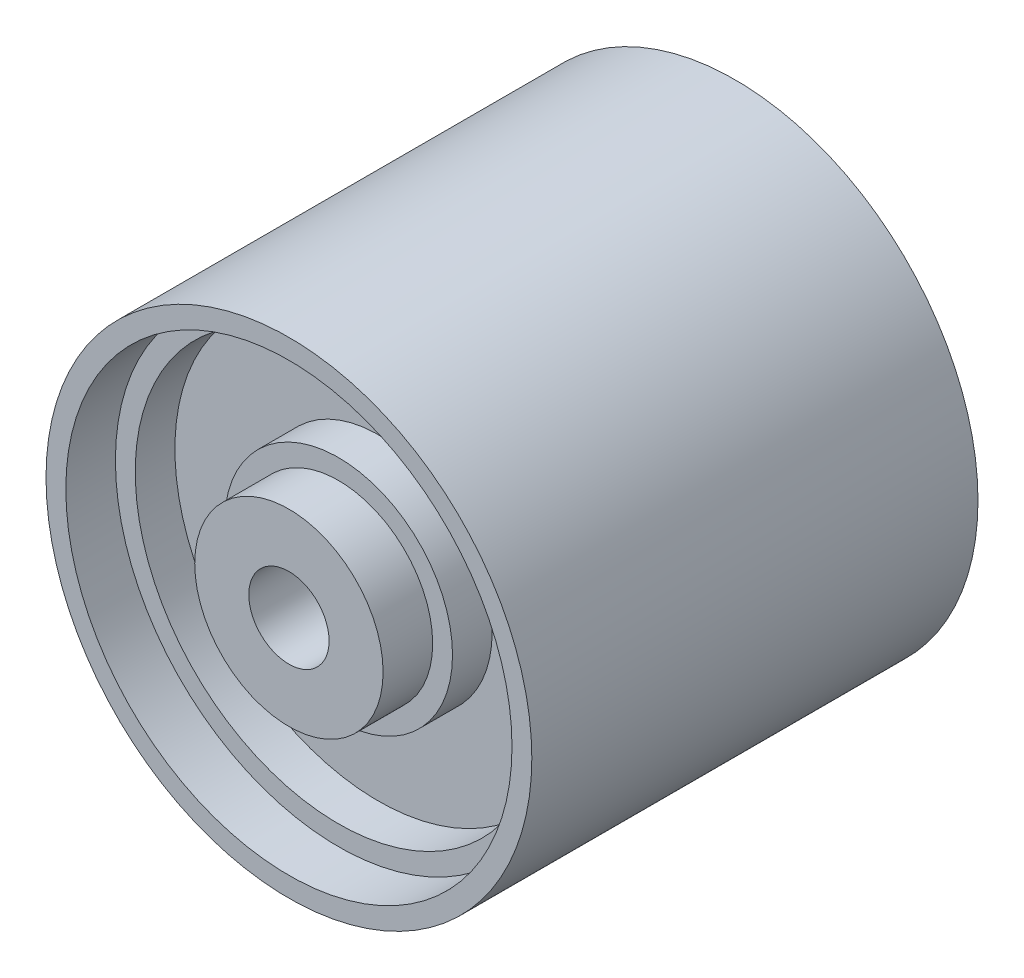
ISO-10303-21;
HEADER;
FILE_DESCRIPTION(('STEP AP214'),'2;1');
FILE_NAME('part.step','',(''),(''),'','','');
FILE_SCHEMA(('AUTOMOTIVE_DESIGN { 1 0 10303 214 1 1 1 1 }'));
ENDSEC;
DATA;
#1=APPLICATION_CONTEXT('core data for automotive mechanical design processes');
#2=APPLICATION_PROTOCOL_DEFINITION('international standard','automotive_design',2000,#1);
#3=PRODUCT_CONTEXT('',#1,'mechanical');
#4=PRODUCT('Part','Part','',(#3));
#5=PRODUCT_RELATED_PRODUCT_CATEGORY('part','',(#4));
#6=PRODUCT_DEFINITION_FORMATION('','',#4);
#7=PRODUCT_DEFINITION_CONTEXT('part definition',#1,'design');
#8=PRODUCT_DEFINITION('design','',#6,#7);
#9=PRODUCT_DEFINITION_SHAPE('','',#8);
#10=(LENGTH_UNIT() NAMED_UNIT(*) SI_UNIT(.MILLI.,.METRE.));
#11=(NAMED_UNIT(*) PLANE_ANGLE_UNIT() SI_UNIT($,.RADIAN.));
#12=(NAMED_UNIT(*) SI_UNIT($,.STERADIAN.) SOLID_ANGLE_UNIT());
#13=UNCERTAINTY_MEASURE_WITH_UNIT(LENGTH_MEASURE(1.E-05),#10,'distance_accuracy_value','');
#14=(GEOMETRIC_REPRESENTATION_CONTEXT(3) GLOBAL_UNCERTAINTY_ASSIGNED_CONTEXT((#13)) GLOBAL_UNIT_ASSIGNED_CONTEXT((#10,
#11,#12)) REPRESENTATION_CONTEXT('',''));
#15=CARTESIAN_POINT('',(0.,0.,0.));
#16=DIRECTION('',(0.,0.,1.));
#17=DIRECTION('',(1.,0.,0.));
#18=AXIS2_PLACEMENT_3D('',#15,#16,#17);
#19=CARTESIAN_POINT('',(0.,0.,-45.));
#20=DIRECTION('',(0.,0.,1.));
#21=DIRECTION('',(1.,0.,0.));
#22=AXIS2_PLACEMENT_3D('',#19,#20,#21);
#23=PLANE('',#22);
#24=CARTESIAN_POINT('',(0.,0.,-45.));
#25=DIRECTION('',(0.,0.,1.));
#26=DIRECTION('',(1.,0.,0.));
#27=AXIS2_PLACEMENT_3D('',#24,#25,#26);
#28=CIRCLE('',#27,4.05);
#29=CARTESIAN_POINT('',(4.05,0.,-45.));
#30=VERTEX_POINT('',#29);
#31=EDGE_CURVE('E45',#30,#30,#28,.T.);
#32=ORIENTED_EDGE('',*,*,#31,.T.);
#33=EDGE_LOOP('',(#32));
#34=FACE_BOUND('',#33,.T.);
#35=CARTESIAN_POINT('',(0.,0.,-45.));
#36=DIRECTION('',(0.,0.,-1.));
#37=DIRECTION('',(-1.,0.,0.));
#38=AXIS2_PLACEMENT_3D('',#35,#36,#37);
#39=CIRCLE('',#38,9.5);
#40=CARTESIAN_POINT('',(-9.5,0.,-45.));
#41=VERTEX_POINT('',#40);
#42=EDGE_CURVE('E111',#41,#41,#39,.T.);
#43=ORIENTED_EDGE('',*,*,#42,.T.);
#44=EDGE_LOOP('',(#43));
#45=FACE_BOUND('',#44,.T.);
#46=ADVANCED_FACE('F32',(#34,#45),#23,.F.);
#47=CARTESIAN_POINT('',(0.,0.,0.));
#48=DIRECTION('',(0.,0.,1.));
#49=DIRECTION('',(1.,0.,0.));
#50=AXIS2_PLACEMENT_3D('',#47,#48,#49);
#51=PLANE('',#50);
#52=CARTESIAN_POINT('',(0.,0.,0.));
#53=DIRECTION('',(0.,0.,1.));
#54=DIRECTION('',(1.,0.,0.));
#55=AXIS2_PLACEMENT_3D('',#52,#53,#54);
#56=CIRCLE('',#55,4.05);
#57=CARTESIAN_POINT('',(4.05,0.,0.));
#58=VERTEX_POINT('',#57);
#59=EDGE_CURVE('E48',#58,#58,#56,.T.);
#60=ORIENTED_EDGE('',*,*,#59,.F.);
#61=EDGE_LOOP('',(#60));
#62=FACE_BOUND('',#61,.T.);
#63=CARTESIAN_POINT('',(0.,0.,0.));
#64=DIRECTION('',(0.,0.,1.));
#65=DIRECTION('',(1.,0.,0.));
#66=AXIS2_PLACEMENT_3D('',#63,#64,#65);
#67=CIRCLE('',#66,9.5);
#68=CARTESIAN_POINT('',(9.5,0.,0.));
#69=VERTEX_POINT('',#68);
#70=EDGE_CURVE('E68',#69,#69,#67,.T.);
#71=ORIENTED_EDGE('',*,*,#70,.T.);
#72=EDGE_LOOP('',(#71));
#73=FACE_BOUND('',#72,.T.);
#74=ADVANCED_FACE('F89',(#62,#73),#51,.T.);
#75=CARTESIAN_POINT('',(0.,0.,-45.));
#76=DIRECTION('',(0.,0.,1.));
#77=DIRECTION('',(1.,0.,0.));
#78=AXIS2_PLACEMENT_3D('',#75,#76,#77);
#79=CYLINDRICAL_SURFACE('',#78,24.5);
#80=CARTESIAN_POINT('',(0.,0.,-45.));
#81=DIRECTION('',(0.,0.,1.));
#82=DIRECTION('',(1.,0.,0.));
#83=AXIS2_PLACEMENT_3D('',#80,#81,#82);
#84=CIRCLE('',#83,24.5);
#85=CARTESIAN_POINT('',(24.5,0.,-45.));
#86=VERTEX_POINT('',#85);
#87=EDGE_CURVE('E10',#86,#86,#84,.T.);
#88=CARTESIAN_POINT('',(0.,0.,0.));
#89=DIRECTION('',(0.,0.,1.));
#90=DIRECTION('',(1.,0.,0.));
#91=AXIS2_PLACEMENT_3D('',#88,#89,#90);
#92=CIRCLE('',#91,24.5);
#93=CARTESIAN_POINT('',(24.5,0.,0.));
#94=VERTEX_POINT('',#93);
#95=EDGE_CURVE('E40',#94,#94,#92,.T.);
#96=CARTESIAN_POINT('',(24.5,0.,-45.));
#97=CARTESIAN_POINT('',(24.5,0.,-44.53125));
#98=CARTESIAN_POINT('',(24.5,0.,-44.0625));
#99=CARTESIAN_POINT('',(24.5,0.,-43.125));
#100=CARTESIAN_POINT('',(24.5,0.,-42.65625));
#101=CARTESIAN_POINT('',(24.5,0.,-41.71875));
#102=CARTESIAN_POINT('',(24.5,0.,-41.25));
#103=CARTESIAN_POINT('',(24.5,0.,-40.3125));
#104=CARTESIAN_POINT('',(24.5,0.,-39.84375));
#105=CARTESIAN_POINT('',(24.5,0.,-38.90625));
#106=CARTESIAN_POINT('',(24.5,0.,-38.4375));
#107=CARTESIAN_POINT('',(24.5,0.,-37.5));
#108=CARTESIAN_POINT('',(24.5,0.,-37.03125));
#109=CARTESIAN_POINT('',(24.5,0.,-36.09375));
#110=CARTESIAN_POINT('',(24.5,0.,-35.625));
#111=CARTESIAN_POINT('',(24.5,0.,-34.6875));
#112=CARTESIAN_POINT('',(24.5,0.,-34.21875));
#113=CARTESIAN_POINT('',(24.5,0.,-33.28125));
#114=CARTESIAN_POINT('',(24.5,0.,-32.8125));
#115=CARTESIAN_POINT('',(24.5,0.,-31.875));
#116=CARTESIAN_POINT('',(24.5,0.,-31.40625));
#117=CARTESIAN_POINT('',(24.5,0.,-30.46875));
#118=CARTESIAN_POINT('',(24.5,0.,-30.));
#119=CARTESIAN_POINT('',(24.5,0.,-29.0625));
#120=CARTESIAN_POINT('',(24.5,0.,-28.59375));
#121=CARTESIAN_POINT('',(24.5,0.,-27.65625));
#122=CARTESIAN_POINT('',(24.5,0.,-27.1875));
#123=CARTESIAN_POINT('',(24.5,0.,-26.25));
#124=CARTESIAN_POINT('',(24.5,0.,-25.78125));
#125=CARTESIAN_POINT('',(24.5,0.,-24.84375));
#126=CARTESIAN_POINT('',(24.5,0.,-24.375));
#127=CARTESIAN_POINT('',(24.5,0.,-23.4375));
#128=CARTESIAN_POINT('',(24.5,0.,-22.96875));
#129=CARTESIAN_POINT('',(24.5,0.,-22.03125));
#130=CARTESIAN_POINT('',(24.5,0.,-21.5625));
#131=CARTESIAN_POINT('',(24.5,0.,-20.625));
#132=CARTESIAN_POINT('',(24.5,0.,-20.15625));
#133=CARTESIAN_POINT('',(24.5,0.,-19.21875));
#134=CARTESIAN_POINT('',(24.5,0.,-18.75));
#135=CARTESIAN_POINT('',(24.5,0.,-17.8125));
#136=CARTESIAN_POINT('',(24.5,0.,-17.34375));
#137=CARTESIAN_POINT('',(24.5,0.,-16.40625));
#138=CARTESIAN_POINT('',(24.5,0.,-15.9375));
#139=CARTESIAN_POINT('',(24.5,0.,-15.));
#140=CARTESIAN_POINT('',(24.5,0.,-14.53125));
#141=CARTESIAN_POINT('',(24.5,0.,-13.59375));
#142=CARTESIAN_POINT('',(24.5,0.,-13.125));
#143=CARTESIAN_POINT('',(24.5,0.,-12.1875));
#144=CARTESIAN_POINT('',(24.5,0.,-11.71875));
#145=CARTESIAN_POINT('',(24.5,0.,-10.78125));
#146=CARTESIAN_POINT('',(24.5,0.,-10.3125));
#147=CARTESIAN_POINT('',(24.5,0.,-9.37500000000001));
#148=CARTESIAN_POINT('',(24.5,0.,-8.90625000000001));
#149=CARTESIAN_POINT('',(24.5,0.,-7.96875000000001));
#150=CARTESIAN_POINT('',(24.5,0.,-7.50000000000001));
#151=CARTESIAN_POINT('',(24.5,0.,-6.56250000000001));
#152=CARTESIAN_POINT('',(24.5,0.,-6.09375000000001));
#153=CARTESIAN_POINT('',(24.5,0.,-5.15625000000001));
#154=CARTESIAN_POINT('',(24.5,0.,-4.68750000000001));
#155=CARTESIAN_POINT('',(24.5,0.,-3.75000000000001));
#156=CARTESIAN_POINT('',(24.5,0.,-3.28125000000001));
#157=CARTESIAN_POINT('',(24.5,0.,-2.34375000000001));
#158=CARTESIAN_POINT('',(24.5,0.,-1.87500000000001));
#159=CARTESIAN_POINT('',(24.5,0.,-0.937500000000006));
#160=CARTESIAN_POINT('',(24.5,0.,-0.468750000000007));
#161=CARTESIAN_POINT('',(24.5,0.,0.));
#162=B_SPLINE_CURVE_WITH_KNOTS('',3,(#96,#97,#98,#99,#100,#101,#102,#103,#104,#105,#106,#107,
#108,#109,#110,#111,#112,#113,#114,#115,#116,#117,#118,#119,#120,#121,#122,#123,#124,#125,#126,
#127,#128,#129,#130,#131,#132,#133,#134,#135,#136,#137,#138,#139,#140,#141,#142,#143,#144,#145,
#146,#147,#148,#149,#150,#151,#152,#153,#154,#155,#156,#157,#158,#159,#160,#161),.UNSPECIFIED.,
.F.,.F.,(4,2,2,2,2,2,2,2,2,2,2,2,2,2,2,2,2,2,2,2,2,2,2,2,2,2,2,2,2,2,2,2,4),(0.,1.40625,2.8125,
4.21875,5.62500000000001,7.03125,8.4375,9.84375000000001,11.25,12.65625,14.0625,15.46875,16.875,
18.28125,19.6875,21.09375,22.5,23.90625,25.3125,26.71875,28.125,29.53125,30.9375,32.34375,33.75,
35.15625,36.5625,37.96875,39.375,40.78125,42.1875,43.59375,45.),.UNSPECIFIED.);
#163=EDGE_CURVE('BSEAM34',#86,#94,#162,.T.);
#164=ORIENTED_EDGE('',*,*,#87,.T.);
#165=ORIENTED_EDGE('',*,*,#95,.F.);
#166=ORIENTED_EDGE('',*,*,#163,.T.);
#167=ORIENTED_EDGE('',*,*,#163,.F.);
#168=EDGE_LOOP('',(#164,#166,#165,#167));
#169=FACE_BOUND('',#168,.T.);
#170=ADVANCED_FACE('F34',(#169),#79,.T.);
#171=CARTESIAN_POINT('',(0.,0.,-45.));
#172=DIRECTION('',(0.,0.,-1.));
#173=DIRECTION('',(-1.,0.,0.));
#174=AXIS2_PLACEMENT_3D('',#171,#172,#173);
#175=CIRCLE('',#174,22.5);
#176=CARTESIAN_POINT('',(-22.5,0.,-45.));
#177=VERTEX_POINT('',#176);
#178=EDGE_CURVE('E105',#177,#177,#175,.T.);
#179=ORIENTED_EDGE('',*,*,#178,.F.);
#180=EDGE_LOOP('',(#179));
#181=FACE_BOUND('',#180,.T.);
#182=ORIENTED_EDGE('',*,*,#87,.F.);
#183=EDGE_LOOP('',(#182));
#184=FACE_BOUND('',#183,.T.);
#185=ADVANCED_FACE('F141',(#181,#184),#23,.F.);
#186=CARTESIAN_POINT('',(0.,0.,0.));
#187=DIRECTION('',(0.,0.,1.));
#188=DIRECTION('',(1.,0.,0.));
#189=AXIS2_PLACEMENT_3D('',#186,#187,#188);
#190=CIRCLE('',#189,22.5);
#191=CARTESIAN_POINT('',(22.5,0.,0.));
#192=VERTEX_POINT('',#191);
#193=EDGE_CURVE('E60',#192,#192,#190,.T.);
#194=ORIENTED_EDGE('',*,*,#193,.F.);
#195=EDGE_LOOP('',(#194));
#196=FACE_BOUND('',#195,.T.);
#197=ORIENTED_EDGE('',*,*,#95,.T.);
#198=EDGE_LOOP('',(#197));
#199=FACE_BOUND('',#198,.T.);
#200=ADVANCED_FACE('F92',(#196,#199),#51,.T.);
#201=CARTESIAN_POINT('',(0.,0.,-45.));
#202=DIRECTION('',(0.,0.,1.));
#203=DIRECTION('',(1.,0.,0.));
#204=AXIS2_PLACEMENT_3D('',#201,#202,#203);
#205=CYLINDRICAL_SURFACE('',#204,4.05);
#206=CARTESIAN_POINT('',(4.05,0.,-45.));
#207=CARTESIAN_POINT('',(4.05,0.,-44.53125));
#208=CARTESIAN_POINT('',(4.05,0.,-44.0625));
#209=CARTESIAN_POINT('',(4.05,0.,-43.125));
#210=CARTESIAN_POINT('',(4.05,0.,-42.65625));
#211=CARTESIAN_POINT('',(4.05,0.,-41.71875));
#212=CARTESIAN_POINT('',(4.05,0.,-41.25));
#213=CARTESIAN_POINT('',(4.05,0.,-40.3125));
#214=CARTESIAN_POINT('',(4.05,0.,-39.84375));
#215=CARTESIAN_POINT('',(4.05,0.,-38.90625));
#216=CARTESIAN_POINT('',(4.05,0.,-38.4375));
#217=CARTESIAN_POINT('',(4.05,0.,-37.5));
#218=CARTESIAN_POINT('',(4.05,0.,-37.03125));
#219=CARTESIAN_POINT('',(4.05,0.,-36.09375));
#220=CARTESIAN_POINT('',(4.05,0.,-35.625));
#221=CARTESIAN_POINT('',(4.05,0.,-34.6875));
#222=CARTESIAN_POINT('',(4.05,0.,-34.21875));
#223=CARTESIAN_POINT('',(4.05,0.,-33.28125));
#224=CARTESIAN_POINT('',(4.05,0.,-32.8125));
#225=CARTESIAN_POINT('',(4.05,0.,-31.875));
#226=CARTESIAN_POINT('',(4.05,0.,-31.40625));
#227=CARTESIAN_POINT('',(4.05,0.,-30.46875));
#228=CARTESIAN_POINT('',(4.05,0.,-30.));
#229=CARTESIAN_POINT('',(4.05,0.,-29.0625));
#230=CARTESIAN_POINT('',(4.05,0.,-28.59375));
#231=CARTESIAN_POINT('',(4.05,0.,-27.65625));
#232=CARTESIAN_POINT('',(4.05,0.,-27.1875));
#233=CARTESIAN_POINT('',(4.05,0.,-26.25));
#234=CARTESIAN_POINT('',(4.05,0.,-25.78125));
#235=CARTESIAN_POINT('',(4.05,0.,-24.84375));
#236=CARTESIAN_POINT('',(4.05,0.,-24.375));
#237=CARTESIAN_POINT('',(4.05,0.,-23.4375));
#238=CARTESIAN_POINT('',(4.05,0.,-22.96875));
#239=CARTESIAN_POINT('',(4.05,0.,-22.03125));
#240=CARTESIAN_POINT('',(4.05,0.,-21.5625));
#241=CARTESIAN_POINT('',(4.05,0.,-20.625));
#242=CARTESIAN_POINT('',(4.05,0.,-20.15625));
#243=CARTESIAN_POINT('',(4.05,0.,-19.21875));
#244=CARTESIAN_POINT('',(4.05,0.,-18.75));
#245=CARTESIAN_POINT('',(4.05,0.,-17.8125));
#246=CARTESIAN_POINT('',(4.05,0.,-17.34375));
#247=CARTESIAN_POINT('',(4.05,0.,-16.40625));
#248=CARTESIAN_POINT('',(4.05,0.,-15.9375));
#249=CARTESIAN_POINT('',(4.05,0.,-15.));
#250=CARTESIAN_POINT('',(4.05,0.,-14.53125));
#251=CARTESIAN_POINT('',(4.05,0.,-13.59375));
#252=CARTESIAN_POINT('',(4.05,0.,-13.125));
#253=CARTESIAN_POINT('',(4.05,0.,-12.1875));
#254=CARTESIAN_POINT('',(4.05,0.,-11.71875));
#255=CARTESIAN_POINT('',(4.05,0.,-10.78125));
#256=CARTESIAN_POINT('',(4.05,0.,-10.3125));
#257=CARTESIAN_POINT('',(4.05,0.,-9.37500000000001));
#258=CARTESIAN_POINT('',(4.05,0.,-8.90625000000001));
#259=CARTESIAN_POINT('',(4.05,0.,-7.96875000000001));
#260=CARTESIAN_POINT('',(4.05,0.,-7.50000000000001));
#261=CARTESIAN_POINT('',(4.05,0.,-6.56250000000001));
#262=CARTESIAN_POINT('',(4.05,0.,-6.09375000000001));
#263=CARTESIAN_POINT('',(4.05,0.,-5.15625000000001));
#264=CARTESIAN_POINT('',(4.05,0.,-4.68750000000001));
#265=CARTESIAN_POINT('',(4.05,0.,-3.75000000000001));
#266=CARTESIAN_POINT('',(4.05,0.,-3.28125000000001));
#267=CARTESIAN_POINT('',(4.05,0.,-2.34375000000001));
#268=CARTESIAN_POINT('',(4.05,0.,-1.87500000000001));
#269=CARTESIAN_POINT('',(4.05,0.,-0.937500000000006));
#270=CARTESIAN_POINT('',(4.05,0.,-0.468750000000007));
#271=CARTESIAN_POINT('',(4.05,0.,0.));
#272=B_SPLINE_CURVE_WITH_KNOTS('',3,(#206,#207,#208,#209,#210,#211,#212,#213,#214,#215,#216,
#217,#218,#219,#220,#221,#222,#223,#224,#225,#226,#227,#228,#229,#230,#231,#232,#233,#234,#235,
#236,#237,#238,#239,#240,#241,#242,#243,#244,#245,#246,#247,#248,#249,#250,#251,#252,#253,#254,
#255,#256,#257,#258,#259,#260,#261,#262,#263,#264,#265,#266,#267,#268,#269,#270,#271),
.UNSPECIFIED.,.F.,.F.,(4,2,2,2,2,2,2,2,2,2,2,2,2,2,2,2,2,2,2,2,2,2,2,2,2,2,2,2,2,2,2,2,4),(0.,
1.40625,2.8125,4.21874999999999,5.625,7.03125,8.43749999999999,9.84375,11.25,12.65625,14.0625,
15.46875,16.875,18.28125,19.6875,21.09375,22.5,23.90625,25.3125,26.71875,28.125,29.53125,
30.9375,32.34375,33.75,35.15625,36.5625,37.96875,39.375,40.78125,42.1875,43.59375,45.),.UNSPECIFIED.);
#273=EDGE_CURVE('BSEAM87',#30,#58,#272,.T.);
#274=ORIENTED_EDGE('',*,*,#31,.F.);
#275=ORIENTED_EDGE('',*,*,#59,.T.);
#276=ORIENTED_EDGE('',*,*,#273,.T.);
#277=ORIENTED_EDGE('',*,*,#273,.F.);
#278=EDGE_LOOP('',(#274,#276,#275,#277));
#279=FACE_BOUND('',#278,.T.);
#280=ADVANCED_FACE('F87',(#279),#205,.F.);
#281=CARTESIAN_POINT('',(0.,0.,-5.));
#282=DIRECTION('',(0.,0.,1.));
#283=DIRECTION('',(1.,0.,0.));
#284=AXIS2_PLACEMENT_3D('',#281,#282,#283);
#285=PLANE('',#284);
#286=CARTESIAN_POINT('',(0.,0.,-5.));
#287=DIRECTION('',(0.,0.,1.));
#288=DIRECTION('',(1.,0.,0.));
#289=AXIS2_PLACEMENT_3D('',#286,#287,#288);
#290=CIRCLE('',#289,11.5);
#291=CARTESIAN_POINT('',(11.5,0.,-5.));
#292=VERTEX_POINT('',#291);
#293=EDGE_CURVE('E50',#292,#292,#290,.F.);
#294=ORIENTED_EDGE('',*,*,#293,.F.);
#295=EDGE_LOOP('',(#294));
#296=FACE_BOUND('',#295,.T.);
#297=CARTESIAN_POINT('',(0.,0.,-5.));
#298=DIRECTION('',(0.,0.,1.));
#299=DIRECTION('',(1.,0.,0.));
#300=AXIS2_PLACEMENT_3D('',#297,#298,#299);
#301=CIRCLE('',#300,9.5);
#302=CARTESIAN_POINT('',(9.5,0.,-5.));
#303=VERTEX_POINT('',#302);
#304=EDGE_CURVE('E65',#303,#303,#301,.T.);
#305=ORIENTED_EDGE('',*,*,#304,.F.);
#306=EDGE_LOOP('',(#305));
#307=FACE_BOUND('',#306,.T.);
#308=ADVANCED_FACE('F171',(#296,#307),#285,.T.);
#309=CARTESIAN_POINT('',(0.,0.,-5.));
#310=DIRECTION('',(0.,0.,1.));
#311=DIRECTION('',(1.,0.,0.));
#312=AXIS2_PLACEMENT_3D('',#309,#310,#311);
#313=CYLINDRICAL_SURFACE('',#312,9.5);
#314=ORIENTED_EDGE('',*,*,#304,.T.);
#315=EDGE_LOOP('',(#314));
#316=FACE_BOUND('',#315,.T.);
#317=ORIENTED_EDGE('',*,*,#70,.F.);
#318=EDGE_LOOP('',(#317));
#319=FACE_BOUND('',#318,.T.);
#320=ADVANCED_FACE('F167',(#316,#319),#313,.T.);
#321=CARTESIAN_POINT('',(0.,0.,-5.));
#322=DIRECTION('',(0.,0.,1.));
#323=DIRECTION('',(1.,0.,0.));
#324=AXIS2_PLACEMENT_3D('',#321,#322,#323);
#325=CIRCLE('',#324,22.5);
#326=CARTESIAN_POINT('',(22.5,0.,-5.));
#327=VERTEX_POINT('',#326);
#328=EDGE_CURVE('E53',#327,#327,#325,.T.);
#329=ORIENTED_EDGE('',*,*,#328,.T.);
#330=EDGE_LOOP('',(#329));
#331=FACE_BOUND('',#330,.T.);
#332=CARTESIAN_POINT('',(0.,0.,-5.));
#333=DIRECTION('',(0.,0.,1.));
#334=DIRECTION('',(1.,0.,0.));
#335=AXIS2_PLACEMENT_3D('',#332,#333,#334);
#336=CIRCLE('',#335,20.5);
#337=CARTESIAN_POINT('',(20.5,0.,-5.));
#338=VERTEX_POINT('',#337);
#339=EDGE_CURVE('E52',#338,#338,#336,.F.);
#340=ORIENTED_EDGE('',*,*,#339,.T.);
#341=EDGE_LOOP('',(#340));
#342=FACE_BOUND('',#341,.T.);
#343=ADVANCED_FACE('F170',(#331,#342),#285,.T.);
#344=CARTESIAN_POINT('',(0.,0.,-5.));
#345=DIRECTION('',(0.,0.,1.));
#346=DIRECTION('',(1.,0.,0.));
#347=AXIS2_PLACEMENT_3D('',#344,#345,#346);
#348=CYLINDRICAL_SURFACE('',#347,22.5);
#349=ORIENTED_EDGE('',*,*,#328,.F.);
#350=EDGE_LOOP('',(#349));
#351=FACE_BOUND('',#350,.T.);
#352=ORIENTED_EDGE('',*,*,#193,.T.);
#353=EDGE_LOOP('',(#352));
#354=FACE_BOUND('',#353,.T.);
#355=ADVANCED_FACE('F176',(#351,#354),#348,.F.);
#356=CARTESIAN_POINT('',(0.,0.,-9.));
#357=DIRECTION('',(0.,0.,1.));
#358=DIRECTION('',(1.,0.,0.));
#359=AXIS2_PLACEMENT_3D('',#356,#357,#358);
#360=CYLINDRICAL_SURFACE('',#359,20.5);
#361=CARTESIAN_POINT('',(0.,0.,-9.));
#362=DIRECTION('',(0.,0.,1.));
#363=DIRECTION('',(1.,0.,0.));
#364=AXIS2_PLACEMENT_3D('',#361,#362,#363);
#365=CIRCLE('',#364,20.5);
#366=CARTESIAN_POINT('',(20.5,0.,-9.));
#367=VERTEX_POINT('',#366);
#368=EDGE_CURVE('E79',#367,#367,#365,.T.);
#369=ORIENTED_EDGE('',*,*,#368,.F.);
#370=EDGE_LOOP('',(#369));
#371=FACE_BOUND('',#370,.T.);
#372=ORIENTED_EDGE('',*,*,#339,.F.);
#373=EDGE_LOOP('',(#372));
#374=FACE_BOUND('',#373,.T.);
#375=ADVANCED_FACE('F179',(#371,#374),#360,.F.);
#376=CARTESIAN_POINT('',(0.,0.,-9.));
#377=DIRECTION('',(0.,0.,1.));
#378=DIRECTION('',(1.,0.,0.));
#379=AXIS2_PLACEMENT_3D('',#376,#377,#378);
#380=PLANE('',#379);
#381=CARTESIAN_POINT('',(0.,0.,-9.));
#382=DIRECTION('',(0.,0.,1.));
#383=DIRECTION('',(1.,0.,0.));
#384=AXIS2_PLACEMENT_3D('',#381,#382,#383);
#385=CIRCLE('',#384,11.5);
#386=CARTESIAN_POINT('',(11.5,0.,-9.));
#387=VERTEX_POINT('',#386);
#388=EDGE_CURVE('E76',#387,#387,#385,.T.);
#389=ORIENTED_EDGE('',*,*,#388,.F.);
#390=EDGE_LOOP('',(#389));
#391=FACE_BOUND('',#390,.T.);
#392=ORIENTED_EDGE('',*,*,#368,.T.);
#393=EDGE_LOOP('',(#392));
#394=FACE_BOUND('',#393,.T.);
#395=ADVANCED_FACE('F131',(#391,#394),#380,.T.);
#396=CARTESIAN_POINT('',(0.,0.,-9.));
#397=DIRECTION('',(0.,0.,1.));
#398=DIRECTION('',(1.,0.,0.));
#399=AXIS2_PLACEMENT_3D('',#396,#397,#398);
#400=CYLINDRICAL_SURFACE('',#399,11.5);
#401=ORIENTED_EDGE('',*,*,#388,.T.);
#402=EDGE_LOOP('',(#401));
#403=FACE_BOUND('',#402,.T.);
#404=ORIENTED_EDGE('',*,*,#293,.T.);
#405=EDGE_LOOP('',(#404));
#406=FACE_BOUND('',#405,.T.);
#407=ADVANCED_FACE('F122',(#403,#406),#400,.T.);
#408=CARTESIAN_POINT('',(0.,0.,-40.));
#409=DIRECTION('',(0.,0.,-1.));
#410=DIRECTION('',(-1.,0.,0.));
#411=AXIS2_PLACEMENT_3D('',#408,#409,#410);
#412=PLANE('',#411);
#413=CARTESIAN_POINT('',(0.,0.,-40.));
#414=DIRECTION('',(0.,0.,-1.));
#415=DIRECTION('',(-1.,0.,0.));
#416=AXIS2_PLACEMENT_3D('',#413,#414,#415);
#417=CIRCLE('',#416,11.5);
#418=CARTESIAN_POINT('',(-11.5,0.,-40.));
#419=VERTEX_POINT('',#418);
#420=EDGE_CURVE('E36',#419,#419,#417,.F.);
#421=ORIENTED_EDGE('',*,*,#420,.F.);
#422=EDGE_LOOP('',(#421));
#423=FACE_BOUND('',#422,.T.);
#424=CARTESIAN_POINT('',(0.,0.,-40.));
#425=DIRECTION('',(0.,0.,-1.));
#426=DIRECTION('',(-1.,0.,0.));
#427=AXIS2_PLACEMENT_3D('',#424,#425,#426);
#428=CIRCLE('',#427,9.5);
#429=CARTESIAN_POINT('',(-9.5,0.,-40.));
#430=VERTEX_POINT('',#429);
#431=EDGE_CURVE('E108',#430,#430,#428,.T.);
#432=ORIENTED_EDGE('',*,*,#431,.F.);
#433=EDGE_LOOP('',(#432));
#434=FACE_BOUND('',#433,.T.);
#435=ADVANCED_FACE('F120',(#423,#434),#412,.T.);
#436=CARTESIAN_POINT('',(0.,0.,-40.));
#437=DIRECTION('',(0.,0.,-1.));
#438=DIRECTION('',(-1.,0.,0.));
#439=AXIS2_PLACEMENT_3D('',#436,#437,#438);
#440=CYLINDRICAL_SURFACE('',#439,9.5);
#441=ORIENTED_EDGE('',*,*,#431,.T.);
#442=EDGE_LOOP('',(#441));
#443=FACE_BOUND('',#442,.T.);
#444=ORIENTED_EDGE('',*,*,#42,.F.);
#445=EDGE_LOOP('',(#444));
#446=FACE_BOUND('',#445,.T.);
#447=ADVANCED_FACE('F117',(#443,#446),#440,.T.);
#448=CARTESIAN_POINT('',(0.,0.,-40.));
#449=DIRECTION('',(0.,0.,-1.));
#450=DIRECTION('',(-1.,0.,0.));
#451=AXIS2_PLACEMENT_3D('',#448,#449,#450);
#452=CIRCLE('',#451,22.5);
#453=CARTESIAN_POINT('',(-22.5,0.,-40.));
#454=VERTEX_POINT('',#453);
#455=EDGE_CURVE('E103',#454,#454,#452,.T.);
#456=ORIENTED_EDGE('',*,*,#455,.T.);
#457=EDGE_LOOP('',(#456));
#458=FACE_BOUND('',#457,.T.);
#459=CARTESIAN_POINT('',(0.,0.,-40.));
#460=DIRECTION('',(0.,0.,-1.));
#461=DIRECTION('',(-1.,0.,0.));
#462=AXIS2_PLACEMENT_3D('',#459,#460,#461);
#463=CIRCLE('',#462,20.5);
#464=CARTESIAN_POINT('',(-20.5,0.,-40.));
#465=VERTEX_POINT('',#464);
#466=EDGE_CURVE('E96',#465,#465,#463,.F.);
#467=ORIENTED_EDGE('',*,*,#466,.T.);
#468=EDGE_LOOP('',(#467));
#469=FACE_BOUND('',#468,.T.);
#470=ADVANCED_FACE('F125',(#458,#469),#412,.T.);
#471=CARTESIAN_POINT('',(0.,0.,-40.));
#472=DIRECTION('',(0.,0.,-1.));
#473=DIRECTION('',(-1.,0.,0.));
#474=AXIS2_PLACEMENT_3D('',#471,#472,#473);
#475=CYLINDRICAL_SURFACE('',#474,22.5);
#476=ORIENTED_EDGE('',*,*,#455,.F.);
#477=EDGE_LOOP('',(#476));
#478=FACE_BOUND('',#477,.T.);
#479=ORIENTED_EDGE('',*,*,#178,.T.);
#480=EDGE_LOOP('',(#479));
#481=FACE_BOUND('',#480,.T.);
#482=ADVANCED_FACE('F137',(#478,#481),#475,.F.);
#483=CARTESIAN_POINT('',(0.,0.,-36.));
#484=DIRECTION('',(0.,0.,-1.));
#485=DIRECTION('',(-1.,0.,0.));
#486=AXIS2_PLACEMENT_3D('',#483,#484,#485);
#487=CYLINDRICAL_SURFACE('',#486,20.5);
#488=CARTESIAN_POINT('',(0.,0.,-36.));
#489=DIRECTION('',(0.,0.,-1.));
#490=DIRECTION('',(-1.,0.,0.));
#491=AXIS2_PLACEMENT_3D('',#488,#489,#490);
#492=CIRCLE('',#491,20.5);
#493=CARTESIAN_POINT('',(-20.5,0.,-36.));
#494=VERTEX_POINT('',#493);
#495=EDGE_CURVE('E73',#494,#494,#492,.T.);
#496=ORIENTED_EDGE('',*,*,#495,.F.);
#497=EDGE_LOOP('',(#496));
#498=FACE_BOUND('',#497,.T.);
#499=ORIENTED_EDGE('',*,*,#466,.F.);
#500=EDGE_LOOP('',(#499));
#501=FACE_BOUND('',#500,.T.);
#502=ADVANCED_FACE('F157',(#498,#501),#487,.F.);
#503=CARTESIAN_POINT('',(0.,0.,-36.));
#504=DIRECTION('',(0.,0.,-1.));
#505=DIRECTION('',(-1.,0.,0.));
#506=AXIS2_PLACEMENT_3D('',#503,#504,#505);
#507=PLANE('',#506);
#508=CARTESIAN_POINT('',(0.,0.,-36.));
#509=DIRECTION('',(0.,0.,-1.));
#510=DIRECTION('',(-1.,0.,0.));
#511=AXIS2_PLACEMENT_3D('',#508,#509,#510);
#512=CIRCLE('',#511,11.5);
#513=CARTESIAN_POINT('',(-11.5,0.,-36.));
#514=VERTEX_POINT('',#513);
#515=EDGE_CURVE('E57',#514,#514,#512,.T.);
#516=ORIENTED_EDGE('',*,*,#515,.F.);
#517=EDGE_LOOP('',(#516));
#518=FACE_BOUND('',#517,.T.);
#519=ORIENTED_EDGE('',*,*,#495,.T.);
#520=EDGE_LOOP('',(#519));
#521=FACE_BOUND('',#520,.T.);
#522=ADVANCED_FACE('F162',(#518,#521),#507,.T.);
#523=CARTESIAN_POINT('',(0.,0.,-36.));
#524=DIRECTION('',(0.,0.,-1.));
#525=DIRECTION('',(-1.,0.,0.));
#526=AXIS2_PLACEMENT_3D('',#523,#524,#525);
#527=CYLINDRICAL_SURFACE('',#526,11.5);
#528=ORIENTED_EDGE('',*,*,#515,.T.);
#529=EDGE_LOOP('',(#528));
#530=FACE_BOUND('',#529,.T.);
#531=ORIENTED_EDGE('',*,*,#420,.T.);
#532=EDGE_LOOP('',(#531));
#533=FACE_BOUND('',#532,.T.);
#534=ADVANCED_FACE('F181',(#530,#533),#527,.T.);
#535=CLOSED_SHELL('',(#46,#74,#170,#185,#200,#280,#308,#320,#343,#355,#375,#395,#407,#435,#447,
#470,#482,#502,#522,#534));
#536=MANIFOLD_SOLID_BREP('B2',#535);
#537=ADVANCED_BREP_SHAPE_REPRESENTATION('',(#18,#536),#14);
#538=SHAPE_DEFINITION_REPRESENTATION(#9,#537);
ENDSEC;
END-ISO-10303-21;
